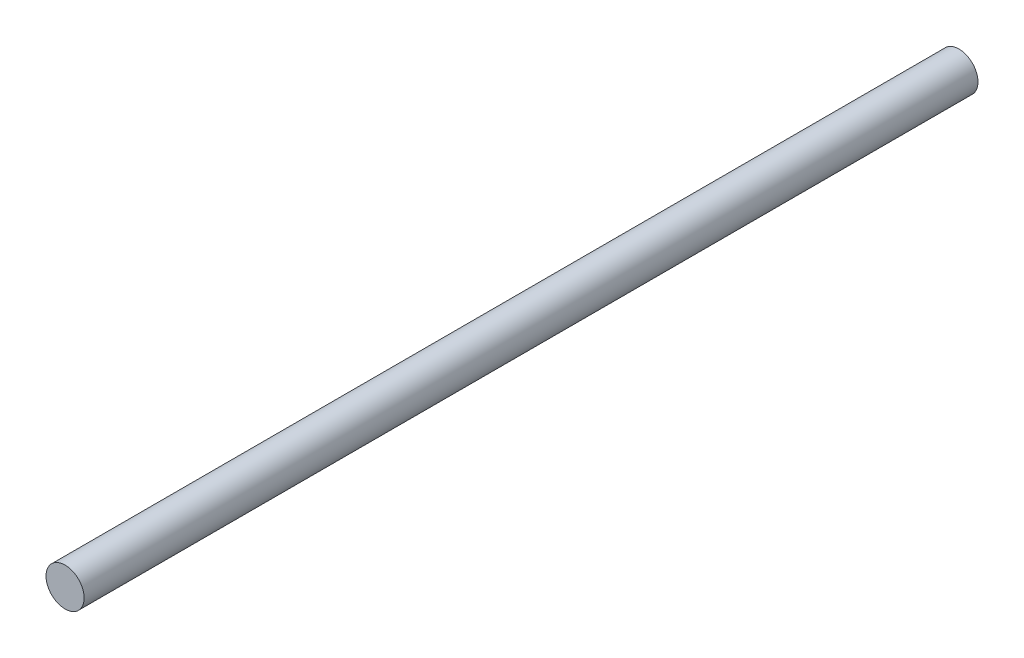
ISO-10303-21;
HEADER;
FILE_DESCRIPTION(('STEP AP214'),'2;1');
FILE_NAME('part.step','',(''),(''),'','','');
FILE_SCHEMA(('AUTOMOTIVE_DESIGN { 1 0 10303 214 1 1 1 1 }'));
ENDSEC;
DATA;
#1=APPLICATION_CONTEXT('core data for automotive mechanical design processes');
#2=APPLICATION_PROTOCOL_DEFINITION('international standard','automotive_design',2000,#1);
#3=PRODUCT_CONTEXT('',#1,'mechanical');
#4=PRODUCT('Part','Part','',(#3));
#5=PRODUCT_RELATED_PRODUCT_CATEGORY('part','',(#4));
#6=PRODUCT_DEFINITION_FORMATION('','',#4);
#7=PRODUCT_DEFINITION_CONTEXT('part definition',#1,'design');
#8=PRODUCT_DEFINITION('design','',#6,#7);
#9=PRODUCT_DEFINITION_SHAPE('','',#8);
#10=(LENGTH_UNIT() NAMED_UNIT(*) SI_UNIT(.MILLI.,.METRE.));
#11=(NAMED_UNIT(*) PLANE_ANGLE_UNIT() SI_UNIT($,.RADIAN.));
#12=(NAMED_UNIT(*) SI_UNIT($,.STERADIAN.) SOLID_ANGLE_UNIT());
#13=UNCERTAINTY_MEASURE_WITH_UNIT(LENGTH_MEASURE(1.E-05),#10,'distance_accuracy_value','');
#14=(GEOMETRIC_REPRESENTATION_CONTEXT(3) GLOBAL_UNCERTAINTY_ASSIGNED_CONTEXT((#13)) GLOBAL_UNIT_ASSIGNED_CONTEXT((#10,
#11,#12)) REPRESENTATION_CONTEXT('',''));
#15=CARTESIAN_POINT('',(0.,0.,0.));
#16=DIRECTION('',(0.,0.,1.));
#17=DIRECTION('',(1.,0.,0.));
#18=AXIS2_PLACEMENT_3D('',#15,#16,#17);
#19=CARTESIAN_POINT('',(0.,0.,37.5231047039901));
#20=DIRECTION('',(0.,0.,1.));
#21=DIRECTION('',(1.,0.,0.));
#22=AXIS2_PLACEMENT_3D('',#19,#20,#21);
#23=PLANE('',#22);
#24=CARTESIAN_POINT('',(0.,0.,37.5231047039901));
#25=DIRECTION('',(0.,0.,-1.));
#26=DIRECTION('',(-1.,0.,0.));
#27=AXIS2_PLACEMENT_3D('',#24,#25,#26);
#28=CIRCLE('',#27,1.6);
#29=CARTESIAN_POINT('',(-1.6,0.,37.5231047039901));
#30=VERTEX_POINT('',#29);
#31=EDGE_CURVE('E9',#30,#30,#28,.T.);
#32=ORIENTED_EDGE('',*,*,#31,.F.);
#33=EDGE_LOOP('',(#32));
#34=FACE_BOUND('',#33,.T.);
#35=ADVANCED_FACE('F14',(#34),#23,.T.);
#36=CARTESIAN_POINT('',(0.,0.,-37.5231047039901));
#37=DIRECTION('',(0.,0.,-1.));
#38=DIRECTION('',(-1.,0.,0.));
#39=AXIS2_PLACEMENT_3D('',#36,#37,#38);
#40=PLANE('',#39);
#41=CARTESIAN_POINT('',(0.,0.,-37.5231047039901));
#42=DIRECTION('',(0.,0.,1.));
#43=DIRECTION('',(1.,0.,0.));
#44=AXIS2_PLACEMENT_3D('',#41,#42,#43);
#45=CIRCLE('',#44,1.6);
#46=CARTESIAN_POINT('',(1.6,0.,-37.5231047039901));
#47=VERTEX_POINT('',#46);
#48=EDGE_CURVE('E21',#47,#47,#45,.T.);
#49=ORIENTED_EDGE('',*,*,#48,.F.);
#50=EDGE_LOOP('',(#49));
#51=FACE_BOUND('',#50,.T.);
#52=ADVANCED_FACE('F29',(#51),#40,.T.);
#53=CARTESIAN_POINT('',(0.,0.,-37.5231047039901));
#54=DIRECTION('',(0.,0.,1.));
#55=DIRECTION('',(1.,0.,0.));
#56=AXIS2_PLACEMENT_3D('',#53,#54,#55);
#57=CYLINDRICAL_SURFACE('',#56,1.6);
#58=ORIENTED_EDGE('',*,*,#31,.T.);
#59=EDGE_LOOP('',(#58));
#60=FACE_BOUND('',#59,.T.);
#61=ORIENTED_EDGE('',*,*,#48,.T.);
#62=EDGE_LOOP('',(#61));
#63=FACE_BOUND('',#62,.T.);
#64=ADVANCED_FACE('F16',(#60,#63),#57,.T.);
#65=CLOSED_SHELL('',(#35,#52,#64));
#66=MANIFOLD_SOLID_BREP('B1',#65);
#67=ADVANCED_BREP_SHAPE_REPRESENTATION('',(#18,#66),#14);
#68=SHAPE_DEFINITION_REPRESENTATION(#9,#67);
ENDSEC;
END-ISO-10303-21;
